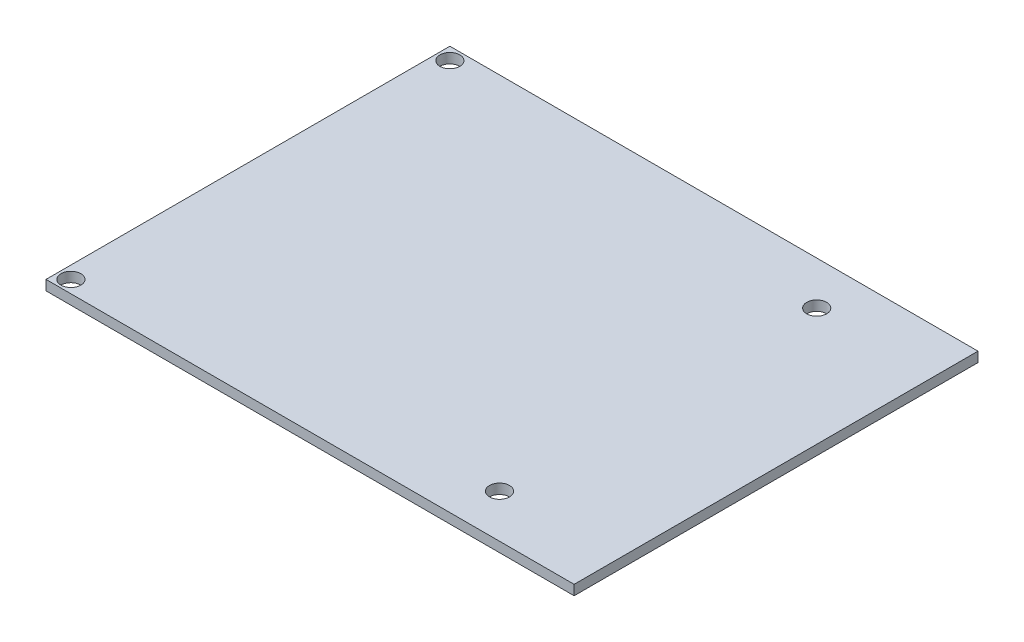
ISO-10303-21;
HEADER;
FILE_DESCRIPTION(('STEP AP214'),'2;1');
FILE_NAME('part.step','',(''),(''),'','','');
FILE_SCHEMA(('AUTOMOTIVE_DESIGN { 1 0 10303 214 1 1 1 1 }'));
ENDSEC;
DATA;
#1=APPLICATION_CONTEXT('core data for automotive mechanical design processes');
#2=APPLICATION_PROTOCOL_DEFINITION('international standard','automotive_design',2000,#1);
#3=PRODUCT_CONTEXT('',#1,'mechanical');
#4=PRODUCT('Part','Part','',(#3));
#5=PRODUCT_RELATED_PRODUCT_CATEGORY('part','',(#4));
#6=PRODUCT_DEFINITION_FORMATION('','',#4);
#7=PRODUCT_DEFINITION_CONTEXT('part definition',#1,'design');
#8=PRODUCT_DEFINITION('design','',#6,#7);
#9=PRODUCT_DEFINITION_SHAPE('','',#8);
#10=(LENGTH_UNIT() NAMED_UNIT(*) SI_UNIT(.MILLI.,.METRE.));
#11=(NAMED_UNIT(*) PLANE_ANGLE_UNIT() SI_UNIT($,.RADIAN.));
#12=(NAMED_UNIT(*) SI_UNIT($,.STERADIAN.) SOLID_ANGLE_UNIT());
#13=UNCERTAINTY_MEASURE_WITH_UNIT(LENGTH_MEASURE(1.E-05),#10,'distance_accuracy_value','');
#14=(GEOMETRIC_REPRESENTATION_CONTEXT(3) GLOBAL_UNCERTAINTY_ASSIGNED_CONTEXT((#13)) GLOBAL_UNIT_ASSIGNED_CONTEXT((#10,
#11,#12)) REPRESENTATION_CONTEXT('',''));
#15=CARTESIAN_POINT('',(0.,0.,0.));
#16=DIRECTION('',(0.,0.,1.));
#17=DIRECTION('',(1.,0.,0.));
#18=AXIS2_PLACEMENT_3D('',#15,#16,#17);
#19=CARTESIAN_POINT('',(0.,1.6,0.));
#20=DIRECTION('',(0.,-1.,0.));
#21=DIRECTION('',(0.,0.,-1.));
#22=AXIS2_PLACEMENT_3D('',#19,#20,#21);
#23=PLANE('',#22);
#24=DIRECTION('',(0.,0.,-1.));
#25=VECTOR('',#24,1.);
#26=CARTESIAN_POINT('',(42.5,1.6,32.5));
#27=LINE('',#26,#25);
#28=CARTESIAN_POINT('',(42.5,1.6,32.5));
#29=VERTEX_POINT('',#28);
#30=CARTESIAN_POINT('',(42.5,1.6,-32.5));
#31=VERTEX_POINT('',#30);
#32=EDGE_CURVE('E87',#29,#31,#27,.T.);
#33=ORIENTED_EDGE('',*,*,#32,.T.);
#34=DIRECTION('',(-1.,0.,0.));
#35=VECTOR('',#34,1.);
#36=CARTESIAN_POINT('',(-42.5,1.6,-32.5));
#37=LINE('',#36,#35);
#38=CARTESIAN_POINT('',(-42.5,1.6,-32.5));
#39=VERTEX_POINT('',#38);
#40=EDGE_CURVE('E82',#31,#39,#37,.T.);
#41=ORIENTED_EDGE('',*,*,#40,.T.);
#42=DIRECTION('',(0.,0.,1.));
#43=VECTOR('',#42,1.);
#44=CARTESIAN_POINT('',(-42.5,1.6,32.5));
#45=LINE('',#44,#43);
#46=CARTESIAN_POINT('',(-42.5,1.6,32.5));
#47=VERTEX_POINT('',#46);
#48=EDGE_CURVE('E85',#39,#47,#45,.T.);
#49=ORIENTED_EDGE('',*,*,#48,.T.);
#50=DIRECTION('',(1.,0.,0.));
#51=VECTOR('',#50,1.);
#52=CARTESIAN_POINT('',(-42.5,1.6,32.5));
#53=LINE('',#52,#51);
#54=EDGE_CURVE('E52',#47,#29,#53,.T.);
#55=ORIENTED_EDGE('',*,*,#54,.T.);
#56=EDGE_LOOP('',(#33,#41,#49,#55));
#57=FACE_BOUND('',#56,.T.);
#58=CARTESIAN_POINT('',(-40.495,1.6,-30.495));
#59=DIRECTION('',(0.,1.,0.));
#60=DIRECTION('',(0.,0.,1.));
#61=AXIS2_PLACEMENT_3D('',#58,#59,#60);
#62=CIRCLE('',#61,1.605);
#63=CARTESIAN_POINT('',(-40.495,1.6,-28.89));
#64=VERTEX_POINT('',#63);
#65=EDGE_CURVE('E102',#64,#64,#62,.T.);
#66=ORIENTED_EDGE('',*,*,#65,.F.);
#67=EDGE_LOOP('',(#66));
#68=FACE_BOUND('',#67,.T.);
#69=CARTESIAN_POINT('',(23.515,1.6,-25.525));
#70=DIRECTION('',(0.,1.,0.));
#71=DIRECTION('',(0.,0.,1.));
#72=AXIS2_PLACEMENT_3D('',#69,#70,#71);
#73=CIRCLE('',#72,1.605);
#74=CARTESIAN_POINT('',(23.515,1.6,-23.92));
#75=VERTEX_POINT('',#74);
#76=EDGE_CURVE('E117',#75,#75,#73,.T.);
#77=ORIENTED_EDGE('',*,*,#76,.F.);
#78=EDGE_LOOP('',(#77));
#79=FACE_BOUND('',#78,.T.);
#80=CARTESIAN_POINT('',(23.515,1.6,25.525));
#81=DIRECTION('',(0.,1.,0.));
#82=DIRECTION('',(0.,0.,-1.));
#83=AXIS2_PLACEMENT_3D('',#80,#81,#82);
#84=CIRCLE('',#83,1.605);
#85=CARTESIAN_POINT('',(23.515,1.6,23.92));
#86=VERTEX_POINT('',#85);
#87=EDGE_CURVE('E123',#86,#86,#84,.T.);
#88=ORIENTED_EDGE('',*,*,#87,.F.);
#89=EDGE_LOOP('',(#88));
#90=FACE_BOUND('',#89,.T.);
#91=CARTESIAN_POINT('',(-40.495,1.6,30.495));
#92=DIRECTION('',(0.,1.,0.));
#93=DIRECTION('',(0.,0.,-1.));
#94=AXIS2_PLACEMENT_3D('',#91,#92,#93);
#95=CIRCLE('',#94,1.605);
#96=CARTESIAN_POINT('',(-40.495,1.6,28.89));
#97=VERTEX_POINT('',#96);
#98=EDGE_CURVE('E129',#97,#97,#95,.T.);
#99=ORIENTED_EDGE('',*,*,#98,.F.);
#100=EDGE_LOOP('',(#99));
#101=FACE_BOUND('',#100,.T.);
#102=ADVANCED_FACE('F35',(#57,#68,#79,#90,#101),#23,.F.);
#103=CARTESIAN_POINT('',(0.,0.,0.));
#104=DIRECTION('',(0.,-1.,0.));
#105=DIRECTION('',(0.,0.,-1.));
#106=AXIS2_PLACEMENT_3D('',#103,#104,#105);
#107=PLANE('',#106);
#108=CARTESIAN_POINT('',(23.515,0.,25.525));
#109=DIRECTION('',(0.,1.,0.));
#110=DIRECTION('',(0.,0.,-1.));
#111=AXIS2_PLACEMENT_3D('',#108,#109,#110);
#112=CIRCLE('',#111,1.605);
#113=CARTESIAN_POINT('',(23.515,0.,23.92));
#114=VERTEX_POINT('',#113);
#115=EDGE_CURVE('E126',#114,#114,#112,.T.);
#116=ORIENTED_EDGE('',*,*,#115,.T.);
#117=EDGE_LOOP('',(#116));
#118=FACE_BOUND('',#117,.T.);
#119=CARTESIAN_POINT('',(-40.495,0.,-30.495));
#120=DIRECTION('',(0.,1.,0.));
#121=DIRECTION('',(0.,0.,1.));
#122=AXIS2_PLACEMENT_3D('',#119,#120,#121);
#123=CIRCLE('',#122,1.605);
#124=CARTESIAN_POINT('',(-40.495,0.,-28.89));
#125=VERTEX_POINT('',#124);
#126=EDGE_CURVE('E114',#125,#125,#123,.T.);
#127=ORIENTED_EDGE('',*,*,#126,.T.);
#128=EDGE_LOOP('',(#127));
#129=FACE_BOUND('',#128,.T.);
#130=DIRECTION('',(0.,0.,-1.));
#131=VECTOR('',#130,1.);
#132=CARTESIAN_POINT('',(42.5,0.,32.5));
#133=LINE('',#132,#131);
#134=CARTESIAN_POINT('',(42.5,0.,32.5));
#135=VERTEX_POINT('',#134);
#136=CARTESIAN_POINT('',(42.5,0.,-32.5));
#137=VERTEX_POINT('',#136);
#138=EDGE_CURVE('E99',#135,#137,#133,.T.);
#139=ORIENTED_EDGE('',*,*,#138,.F.);
#140=DIRECTION('',(1.,0.,0.));
#141=VECTOR('',#140,1.);
#142=CARTESIAN_POINT('',(-42.5,0.,32.5));
#143=LINE('',#142,#141);
#144=CARTESIAN_POINT('',(-42.5,0.,32.5));
#145=VERTEX_POINT('',#144);
#146=EDGE_CURVE('E75',#145,#135,#143,.T.);
#147=ORIENTED_EDGE('',*,*,#146,.F.);
#148=DIRECTION('',(0.,0.,1.));
#149=VECTOR('',#148,1.);
#150=CARTESIAN_POINT('',(-42.5,0.,32.5));
#151=LINE('',#150,#149);
#152=CARTESIAN_POINT('',(-42.5,0.,-32.5));
#153=VERTEX_POINT('',#152);
#154=EDGE_CURVE('E69',#153,#145,#151,.T.);
#155=ORIENTED_EDGE('',*,*,#154,.F.);
#156=DIRECTION('',(-1.,0.,0.));
#157=VECTOR('',#156,1.);
#158=CARTESIAN_POINT('',(-42.5,0.,-32.5));
#159=LINE('',#158,#157);
#160=EDGE_CURVE('E91',#137,#153,#159,.T.);
#161=ORIENTED_EDGE('',*,*,#160,.F.);
#162=EDGE_LOOP('',(#139,#147,#155,#161));
#163=FACE_BOUND('',#162,.T.);
#164=CARTESIAN_POINT('',(23.515,0.,-25.525));
#165=DIRECTION('',(0.,1.,0.));
#166=DIRECTION('',(0.,0.,1.));
#167=AXIS2_PLACEMENT_3D('',#164,#165,#166);
#168=CIRCLE('',#167,1.605);
#169=CARTESIAN_POINT('',(23.515,0.,-23.92));
#170=VERTEX_POINT('',#169);
#171=EDGE_CURVE('E120',#170,#170,#168,.T.);
#172=ORIENTED_EDGE('',*,*,#171,.T.);
#173=EDGE_LOOP('',(#172));
#174=FACE_BOUND('',#173,.T.);
#175=CARTESIAN_POINT('',(-40.495,0.,30.495));
#176=DIRECTION('',(0.,1.,0.));
#177=DIRECTION('',(0.,0.,-1.));
#178=AXIS2_PLACEMENT_3D('',#175,#176,#177);
#179=CIRCLE('',#178,1.605);
#180=CARTESIAN_POINT('',(-40.495,0.,28.89));
#181=VERTEX_POINT('',#180);
#182=EDGE_CURVE('E132',#181,#181,#179,.T.);
#183=ORIENTED_EDGE('',*,*,#182,.T.);
#184=EDGE_LOOP('',(#183));
#185=FACE_BOUND('',#184,.T.);
#186=ADVANCED_FACE('F110',(#118,#129,#163,#174,#185),#107,.T.);
#187=CARTESIAN_POINT('',(42.5,1.6,32.5));
#188=DIRECTION('',(-1.,0.,0.));
#189=DIRECTION('',(0.,0.,1.));
#190=AXIS2_PLACEMENT_3D('',#187,#188,#189);
#191=PLANE('',#190);
#192=ORIENTED_EDGE('',*,*,#138,.T.);
#193=DIRECTION('',(0.,-1.,0.));
#194=VECTOR('',#193,1.);
#195=CARTESIAN_POINT('',(42.5,1.6,-32.5));
#196=LINE('',#195,#194);
#197=EDGE_CURVE('E11',#31,#137,#196,.T.);
#198=ORIENTED_EDGE('',*,*,#197,.F.);
#199=ORIENTED_EDGE('',*,*,#32,.F.);
#200=DIRECTION('',(0.,-1.,0.));
#201=VECTOR('',#200,1.);
#202=CARTESIAN_POINT('',(42.5,1.6,32.5));
#203=LINE('',#202,#201);
#204=EDGE_CURVE('E95',#29,#135,#203,.T.);
#205=ORIENTED_EDGE('',*,*,#204,.T.);
#206=EDGE_LOOP('',(#192,#198,#199,#205));
#207=FACE_BOUND('',#206,.T.);
#208=ADVANCED_FACE('F37',(#207),#191,.F.);
#209=CARTESIAN_POINT('',(-42.5,1.6,-32.5));
#210=DIRECTION('',(0.,0.,1.));
#211=DIRECTION('',(1.,0.,0.));
#212=AXIS2_PLACEMENT_3D('',#209,#210,#211);
#213=PLANE('',#212);
#214=ORIENTED_EDGE('',*,*,#160,.T.);
#215=DIRECTION('',(0.,-1.,0.));
#216=VECTOR('',#215,1.);
#217=CARTESIAN_POINT('',(-42.5,1.6,-32.5));
#218=LINE('',#217,#216);
#219=EDGE_CURVE('E44',#39,#153,#218,.T.);
#220=ORIENTED_EDGE('',*,*,#219,.F.);
#221=ORIENTED_EDGE('',*,*,#40,.F.);
#222=ORIENTED_EDGE('',*,*,#197,.T.);
#223=EDGE_LOOP('',(#214,#220,#221,#222));
#224=FACE_BOUND('',#223,.T.);
#225=ADVANCED_FACE('F90',(#224),#213,.F.);
#226=CARTESIAN_POINT('',(-42.5,1.6,32.5));
#227=DIRECTION('',(1.,0.,0.));
#228=DIRECTION('',(0.,0.,-1.));
#229=AXIS2_PLACEMENT_3D('',#226,#227,#228);
#230=PLANE('',#229);
#231=ORIENTED_EDGE('',*,*,#154,.T.);
#232=DIRECTION('',(0.,-1.,0.));
#233=VECTOR('',#232,1.);
#234=CARTESIAN_POINT('',(-42.5,1.6,32.5));
#235=LINE('',#234,#233);
#236=EDGE_CURVE('E92',#47,#145,#235,.T.);
#237=ORIENTED_EDGE('',*,*,#236,.F.);
#238=ORIENTED_EDGE('',*,*,#48,.F.);
#239=ORIENTED_EDGE('',*,*,#219,.T.);
#240=EDGE_LOOP('',(#231,#237,#238,#239));
#241=FACE_BOUND('',#240,.T.);
#242=ADVANCED_FACE('F93',(#241),#230,.F.);
#243=CARTESIAN_POINT('',(-42.5,1.6,32.5));
#244=DIRECTION('',(0.,0.,-1.));
#245=DIRECTION('',(-1.,0.,0.));
#246=AXIS2_PLACEMENT_3D('',#243,#244,#245);
#247=PLANE('',#246);
#248=ORIENTED_EDGE('',*,*,#146,.T.);
#249=ORIENTED_EDGE('',*,*,#204,.F.);
#250=ORIENTED_EDGE('',*,*,#54,.F.);
#251=ORIENTED_EDGE('',*,*,#236,.T.);
#252=EDGE_LOOP('',(#248,#249,#250,#251));
#253=FACE_BOUND('',#252,.T.);
#254=ADVANCED_FACE('F107',(#253),#247,.F.);
#255=CARTESIAN_POINT('',(-40.495,1.6,-30.495));
#256=DIRECTION('',(0.,-1.,0.));
#257=DIRECTION('',(0.,0.,-1.));
#258=AXIS2_PLACEMENT_3D('',#255,#256,#257);
#259=CYLINDRICAL_SURFACE('',#258,1.605);
#260=ORIENTED_EDGE('',*,*,#65,.T.);
#261=EDGE_LOOP('',(#260));
#262=FACE_BOUND('',#261,.T.);
#263=ORIENTED_EDGE('',*,*,#126,.F.);
#264=EDGE_LOOP('',(#263));
#265=FACE_BOUND('',#264,.T.);
#266=ADVANCED_FACE('F149',(#262,#265),#259,.F.);
#267=CARTESIAN_POINT('',(23.515,1.6,-25.525));
#268=DIRECTION('',(0.,-1.,0.));
#269=DIRECTION('',(0.,0.,-1.));
#270=AXIS2_PLACEMENT_3D('',#267,#268,#269);
#271=CYLINDRICAL_SURFACE('',#270,1.605);
#272=ORIENTED_EDGE('',*,*,#76,.T.);
#273=EDGE_LOOP('',(#272));
#274=FACE_BOUND('',#273,.T.);
#275=ORIENTED_EDGE('',*,*,#171,.F.);
#276=EDGE_LOOP('',(#275));
#277=FACE_BOUND('',#276,.T.);
#278=ADVANCED_FACE('F195',(#274,#277),#271,.F.);
#279=CARTESIAN_POINT('',(23.515,1.6,25.525));
#280=DIRECTION('',(0.,-1.,0.));
#281=DIRECTION('',(0.,0.,-1.));
#282=AXIS2_PLACEMENT_3D('',#279,#280,#281);
#283=CYLINDRICAL_SURFACE('',#282,1.605);
#284=ORIENTED_EDGE('',*,*,#87,.T.);
#285=EDGE_LOOP('',(#284));
#286=FACE_BOUND('',#285,.T.);
#287=ORIENTED_EDGE('',*,*,#115,.F.);
#288=EDGE_LOOP('',(#287));
#289=FACE_BOUND('',#288,.T.);
#290=ADVANCED_FACE('F203',(#286,#289),#283,.F.);
#291=CARTESIAN_POINT('',(-40.495,1.6,30.495));
#292=DIRECTION('',(0.,-1.,0.));
#293=DIRECTION('',(0.,0.,-1.));
#294=AXIS2_PLACEMENT_3D('',#291,#292,#293);
#295=CYLINDRICAL_SURFACE('',#294,1.605);
#296=ORIENTED_EDGE('',*,*,#98,.T.);
#297=EDGE_LOOP('',(#296));
#298=FACE_BOUND('',#297,.T.);
#299=ORIENTED_EDGE('',*,*,#182,.F.);
#300=EDGE_LOOP('',(#299));
#301=FACE_BOUND('',#300,.T.);
#302=ADVANCED_FACE('F138',(#298,#301),#295,.F.);
#303=CLOSED_SHELL('',(#102,#186,#208,#225,#242,#254,#266,#278,#290,#302));
#304=MANIFOLD_SOLID_BREP('B2',#303);
#305=ADVANCED_BREP_SHAPE_REPRESENTATION('',(#18,#304),#14);
#306=SHAPE_DEFINITION_REPRESENTATION(#9,#305);
ENDSEC;
END-ISO-10303-21;
